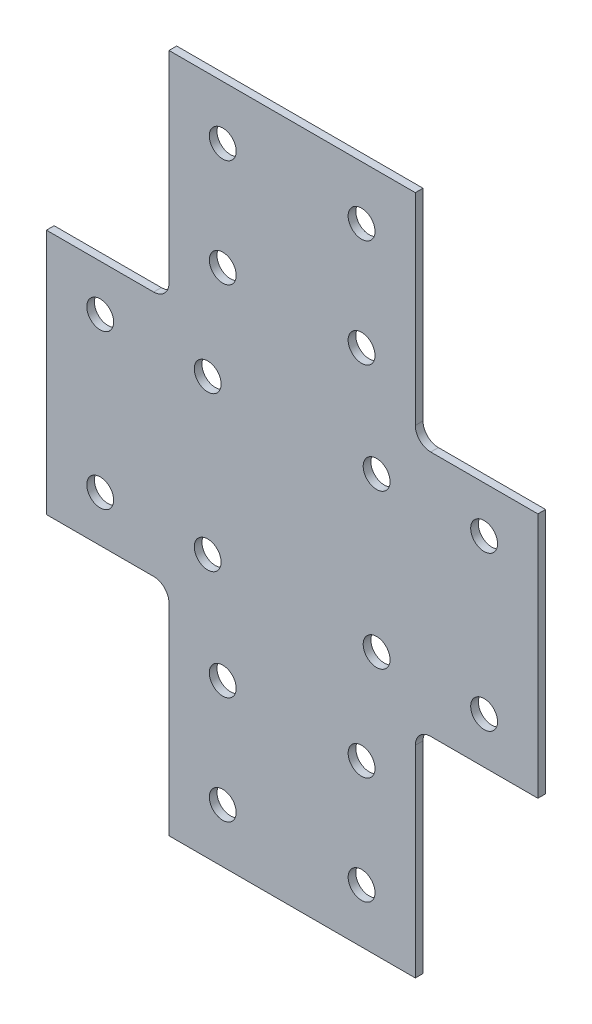
ISO-10303-21;
HEADER;
FILE_DESCRIPTION(('STEP AP214'),'2;1');
FILE_NAME('part.step','',(''),(''),'','','');
FILE_SCHEMA(('AUTOMOTIVE_DESIGN { 1 0 10303 214 1 1 1 1 }'));
ENDSEC;
DATA;
#1=APPLICATION_CONTEXT('core data for automotive mechanical design processes');
#2=APPLICATION_PROTOCOL_DEFINITION('international standard','automotive_design',2000,#1);
#3=PRODUCT_CONTEXT('',#1,'mechanical');
#4=PRODUCT('Part','Part','',(#3));
#5=PRODUCT_RELATED_PRODUCT_CATEGORY('part','',(#4));
#6=PRODUCT_DEFINITION_FORMATION('','',#4);
#7=PRODUCT_DEFINITION_CONTEXT('part definition',#1,'design');
#8=PRODUCT_DEFINITION('design','',#6,#7);
#9=PRODUCT_DEFINITION_SHAPE('','',#8);
#10=(LENGTH_UNIT() NAMED_UNIT(*) SI_UNIT(.MILLI.,.METRE.));
#11=(NAMED_UNIT(*) PLANE_ANGLE_UNIT() SI_UNIT($,.RADIAN.));
#12=(NAMED_UNIT(*) SI_UNIT($,.STERADIAN.) SOLID_ANGLE_UNIT());
#13=UNCERTAINTY_MEASURE_WITH_UNIT(LENGTH_MEASURE(1.E-05),#10,'distance_accuracy_value','');
#14=(GEOMETRIC_REPRESENTATION_CONTEXT(3) GLOBAL_UNCERTAINTY_ASSIGNED_CONTEXT((#13)) GLOBAL_UNIT_ASSIGNED_CONTEXT((#10,
#11,#12)) REPRESENTATION_CONTEXT('',''));
#15=CARTESIAN_POINT('',(0.,0.,0.));
#16=DIRECTION('',(0.,0.,1.));
#17=DIRECTION('',(1.,0.,0.));
#18=AXIS2_PLACEMENT_3D('',#15,#16,#17);
#19=CARTESIAN_POINT('',(20.2073636978671,1349.50975301925,6.35));
#20=DIRECTION('',(0.,0.,-1.));
#21=DIRECTION('',(-1.,0.,0.));
#22=AXIS2_PLACEMENT_3D('',#19,#20,#21);
#23=PLANE('',#22);
#24=CARTESIAN_POINT('',(77.103363697867,1566.99725301925,6.35));
#25=DIRECTION('',(0.,0.,1.));
#26=DIRECTION('',(1.,0.,0.));
#27=AXIS2_PLACEMENT_3D('',#24,#25,#26);
#28=CIRCLE('',#27,11.1125000000001);
#29=CARTESIAN_POINT('',(88.2158636978671,1566.99725301925,6.35));
#30=VERTEX_POINT('',#29);
#31=EDGE_CURVE('E644',#30,#30,#28,.T.);
#32=ORIENTED_EDGE('',*,*,#31,.F.);
#33=EDGE_LOOP('',(#32));
#34=FACE_BOUND('',#33,.T.);
#35=CARTESIAN_POINT('',(-24.2426363021329,1778.64275301925,6.35));
#36=DIRECTION('',(0.,0.,1.));
#37=DIRECTION('',(-1.,0.,0.));
#38=AXIS2_PLACEMENT_3D('',#35,#36,#37);
#39=CIRCLE('',#38,11.1125000000001);
#40=CARTESIAN_POINT('',(-35.3551363021329,1778.64275301925,6.35));
#41=VERTEX_POINT('',#40);
#42=EDGE_CURVE('E656',#41,#41,#39,.T.);
#43=ORIENTED_EDGE('',*,*,#42,.F.);
#44=EDGE_LOOP('',(#43));
#45=FACE_BOUND('',#44,.T.);
#46=CARTESIAN_POINT('',(-139.050636302133,1482.85975301925,6.35));
#47=DIRECTION('',(0.,0.,1.));
#48=DIRECTION('',(-1.,0.,0.));
#49=AXIS2_PLACEMENT_3D('',#46,#47,#48);
#50=CIRCLE('',#49,11.1125000000001);
#51=CARTESIAN_POINT('',(-150.163136302133,1482.85975301925,6.35));
#52=VERTEX_POINT('',#51);
#53=EDGE_CURVE('E668',#52,#52,#50,.T.);
#54=ORIENTED_EDGE('',*,*,#53,.F.);
#55=EDGE_LOOP('',(#54));
#56=FACE_BOUND('',#55,.T.);
#57=CARTESIAN_POINT('',(-139.050636302133,1778.64275301925,6.35));
#58=DIRECTION('',(0.,0.,1.));
#59=DIRECTION('',(1.,0.,0.));
#60=AXIS2_PLACEMENT_3D('',#57,#58,#59);
#61=CIRCLE('',#60,11.1125000000001);
#62=CARTESIAN_POINT('',(-127.938136302133,1778.64275301925,6.35));
#63=VERTEX_POINT('',#62);
#64=EDGE_CURVE('E680',#63,#63,#61,.T.);
#65=ORIENTED_EDGE('',*,*,#64,.F.);
#66=EDGE_LOOP('',(#65));
#67=FACE_BOUND('',#66,.T.);
#68=CARTESIAN_POINT('',(-151.496636302133,1566.99725301925,6.35));
#69=DIRECTION('',(0.,0.,1.));
#70=DIRECTION('',(-1.,0.,0.));
#71=AXIS2_PLACEMENT_3D('',#68,#69,#70);
#72=CIRCLE('',#71,11.1125000000001);
#73=CARTESIAN_POINT('',(-162.609136302133,1566.99725301925,6.35));
#74=VERTEX_POINT('',#73);
#75=EDGE_CURVE('E692',#74,#74,#72,.T.);
#76=ORIENTED_EDGE('',*,*,#75,.F.);
#77=EDGE_LOOP('',(#76));
#78=FACE_BOUND('',#77,.T.);
#79=CARTESIAN_POINT('',(-24.2426363021329,1393.95975301925,6.35));
#80=DIRECTION('',(0.,0.,1.));
#81=DIRECTION('',(1.,0.,0.));
#82=AXIS2_PLACEMENT_3D('',#79,#80,#81);
#83=CIRCLE('',#82,11.1125000000001);
#84=CARTESIAN_POINT('',(-13.1301363021328,1393.95975301925,6.35));
#85=VERTEX_POINT('',#84);
#86=EDGE_CURVE('E704',#85,#85,#83,.T.);
#87=ORIENTED_EDGE('',*,*,#86,.F.);
#88=EDGE_LOOP('',(#87));
#89=FACE_BOUND('',#88,.T.);
#90=CARTESIAN_POINT('',(-11.796636302133,1694.50525301925,6.35));
#91=DIRECTION('',(0.,0.,1.));
#92=DIRECTION('',(-1.,0.,0.));
#93=AXIS2_PLACEMENT_3D('',#90,#91,#92);
#94=CIRCLE('',#93,11.1125000000001);
#95=CARTESIAN_POINT('',(-22.9091363021332,1694.50525301925,6.35));
#96=VERTEX_POINT('',#95);
#97=EDGE_CURVE('E716',#96,#96,#94,.T.);
#98=ORIENTED_EDGE('',*,*,#97,.F.);
#99=EDGE_LOOP('',(#98));
#100=FACE_BOUND('',#99,.T.);
#101=CARTESIAN_POINT('',(-139.050636302133,1867.54275301925,6.35));
#102=DIRECTION('',(0.,0.,1.));
#103=DIRECTION('',(1.,0.,0.));
#104=AXIS2_PLACEMENT_3D('',#101,#102,#103);
#105=CIRCLE('',#104,11.1125000000001);
#106=CARTESIAN_POINT('',(-127.938136302133,1867.54275301925,6.35));
#107=VERTEX_POINT('',#106);
#108=EDGE_CURVE('E195',#107,#107,#105,.T.);
#109=ORIENTED_EDGE('',*,*,#108,.F.);
#110=EDGE_LOOP('',(#109));
#111=FACE_BOUND('',#110,.T.);
#112=DIRECTION('',(0.,1.,0.));
#113=VECTOR('',#112,1.);
#114=CARTESIAN_POINT('',(20.2073636978671,1528.89725301925,6.35));
#115=LINE('',#114,#113);
#116=CARTESIAN_POINT('',(20.2073636978671,1349.50975301925,6.35));
#117=VERTEX_POINT('',#116);
#118=CARTESIAN_POINT('',(20.2073636978671,1516.19725301925,6.35));
#119=VERTEX_POINT('',#118);
#120=EDGE_CURVE('E155',#117,#119,#115,.T.);
#121=ORIENTED_EDGE('',*,*,#120,.T.);
#122=CARTESIAN_POINT('',(32.9073636978671,1516.19725301925,6.35));
#123=DIRECTION('',(0.,0.,-1.));
#124=DIRECTION('',(-1.,0.,0.));
#125=AXIS2_PLACEMENT_3D('',#122,#123,#124);
#126=CIRCLE('',#125,12.7);
#127=CARTESIAN_POINT('',(32.9073636978671,1528.89725301925,6.35));
#128=VERTEX_POINT('',#127);
#129=EDGE_CURVE('E11',#119,#128,#126,.T.);
#130=ORIENTED_EDGE('',*,*,#129,.T.);
#131=DIRECTION('',(1.,0.,0.));
#132=VECTOR('',#131,1.);
#133=CARTESIAN_POINT('',(20.2073636978671,1528.89725301925,6.35));
#134=LINE('',#133,#132);
#135=CARTESIAN_POINT('',(121.553363697867,1528.89725301925,6.35));
#136=VERTEX_POINT('',#135);
#137=EDGE_CURVE('E144',#128,#136,#134,.T.);
#138=ORIENTED_EDGE('',*,*,#137,.T.);
#139=DIRECTION('',(0.,1.,0.));
#140=VECTOR('',#139,1.);
#141=CARTESIAN_POINT('',(121.553363697867,1528.89725301925,6.35));
#142=LINE('',#141,#140);
#143=CARTESIAN_POINT('',(121.553363697867,1732.60525301925,6.35));
#144=VERTEX_POINT('',#143);
#145=EDGE_CURVE('E149',#136,#144,#142,.T.);
#146=ORIENTED_EDGE('',*,*,#145,.T.);
#147=DIRECTION('',(-1.,0.,0.));
#148=VECTOR('',#147,1.);
#149=CARTESIAN_POINT('',(121.553363697867,1732.60525301925,6.35));
#150=LINE('',#149,#148);
#151=CARTESIAN_POINT('',(32.9073636978671,1732.60525301925,6.35));
#152=VERTEX_POINT('',#151);
#153=EDGE_CURVE('E169',#144,#152,#150,.T.);
#154=ORIENTED_EDGE('',*,*,#153,.T.);
#155=CARTESIAN_POINT('',(32.9073636978671,1745.30525301925,6.35));
#156=DIRECTION('',(0.,0.,-1.));
#157=DIRECTION('',(-1.,0.,0.));
#158=AXIS2_PLACEMENT_3D('',#155,#156,#157);
#159=CIRCLE('',#158,12.7);
#160=CARTESIAN_POINT('',(20.2073636978671,1745.30525301925,6.35));
#161=VERTEX_POINT('',#160);
#162=EDGE_CURVE('E265',#152,#161,#159,.T.);
#163=ORIENTED_EDGE('',*,*,#162,.T.);
#164=DIRECTION('',(0.,1.,0.));
#165=VECTOR('',#164,1.);
#166=CARTESIAN_POINT('',(20.207363697867,1732.60525301925,6.35));
#167=LINE('',#166,#165);
#168=CARTESIAN_POINT('',(20.2073636978671,1911.99275301925,6.35));
#169=VERTEX_POINT('',#168);
#170=EDGE_CURVE('E171',#161,#169,#167,.T.);
#171=ORIENTED_EDGE('',*,*,#170,.T.);
#172=DIRECTION('',(-1.,0.,0.));
#173=VECTOR('',#172,1.);
#174=CARTESIAN_POINT('',(20.2073636978671,1911.99275301925,6.35));
#175=LINE('',#174,#173);
#176=CARTESIAN_POINT('',(-183.500636302133,1911.99275301925,6.35));
#177=VERTEX_POINT('',#176);
#178=EDGE_CURVE('E176',#169,#177,#175,.T.);
#179=ORIENTED_EDGE('',*,*,#178,.T.);
#180=DIRECTION('',(0.,-1.,0.));
#181=VECTOR('',#180,1.);
#182=CARTESIAN_POINT('',(-183.500636302133,1732.60525301925,6.35));
#183=LINE('',#182,#181);
#184=CARTESIAN_POINT('',(-183.500636302133,1745.30525301925,6.35));
#185=VERTEX_POINT('',#184);
#186=EDGE_CURVE('E178',#177,#185,#183,.T.);
#187=ORIENTED_EDGE('',*,*,#186,.T.);
#188=CARTESIAN_POINT('',(-196.200636302133,1745.30525301925,6.35));
#189=DIRECTION('',(0.,0.,-1.));
#190=DIRECTION('',(-1.,0.,0.));
#191=AXIS2_PLACEMENT_3D('',#188,#189,#190);
#192=CIRCLE('',#191,12.7);
#193=CARTESIAN_POINT('',(-196.200636302133,1732.60525301925,6.35));
#194=VERTEX_POINT('',#193);
#195=EDGE_CURVE('E261',#185,#194,#192,.T.);
#196=ORIENTED_EDGE('',*,*,#195,.T.);
#197=DIRECTION('',(-1.,0.,0.));
#198=VECTOR('',#197,1.);
#199=CARTESIAN_POINT('',(-284.846636302133,1732.60525301925,6.35));
#200=LINE('',#199,#198);
#201=CARTESIAN_POINT('',(-284.846636302133,1732.60525301925,6.35));
#202=VERTEX_POINT('',#201);
#203=EDGE_CURVE('E181',#194,#202,#200,.T.);
#204=ORIENTED_EDGE('',*,*,#203,.T.);
#205=DIRECTION('',(0.,-1.,0.));
#206=VECTOR('',#205,1.);
#207=CARTESIAN_POINT('',(-284.846636302133,1528.89725301925,6.35));
#208=LINE('',#207,#206);
#209=CARTESIAN_POINT('',(-284.846636302133,1528.89725301925,6.35));
#210=VERTEX_POINT('',#209);
#211=EDGE_CURVE('E183',#202,#210,#208,.T.);
#212=ORIENTED_EDGE('',*,*,#211,.T.);
#213=DIRECTION('',(1.,0.,0.));
#214=VECTOR('',#213,1.);
#215=CARTESIAN_POINT('',(-183.500636302133,1528.89725301925,6.35));
#216=LINE('',#215,#214);
#217=CARTESIAN_POINT('',(-196.200636302133,1528.89725301925,6.35));
#218=VERTEX_POINT('',#217);
#219=EDGE_CURVE('E185',#210,#218,#216,.T.);
#220=ORIENTED_EDGE('',*,*,#219,.T.);
#221=CARTESIAN_POINT('',(-196.200636302133,1516.19725301925,6.35));
#222=DIRECTION('',(0.,0.,-1.));
#223=DIRECTION('',(-1.,0.,0.));
#224=AXIS2_PLACEMENT_3D('',#221,#222,#223);
#225=CIRCLE('',#224,12.7);
#226=CARTESIAN_POINT('',(-183.500636302133,1516.19725301925,6.35));
#227=VERTEX_POINT('',#226);
#228=EDGE_CURVE('E257',#218,#227,#225,.T.);
#229=ORIENTED_EDGE('',*,*,#228,.T.);
#230=DIRECTION('',(0.,-1.,0.));
#231=VECTOR('',#230,1.);
#232=CARTESIAN_POINT('',(-183.500636302133,1349.50975301925,6.35));
#233=LINE('',#232,#231);
#234=CARTESIAN_POINT('',(-183.500636302133,1349.50975301925,6.35));
#235=VERTEX_POINT('',#234);
#236=EDGE_CURVE('E188',#227,#235,#233,.T.);
#237=ORIENTED_EDGE('',*,*,#236,.T.);
#238=DIRECTION('',(1.,0.,0.));
#239=VECTOR('',#238,1.);
#240=CARTESIAN_POINT('',(20.2073636978671,1349.50975301925,6.35));
#241=LINE('',#240,#239);
#242=EDGE_CURVE('E190',#235,#117,#241,.T.);
#243=ORIENTED_EDGE('',*,*,#242,.T.);
#244=EDGE_LOOP('',(#121,#130,#138,#146,#154,#163,#171,#179,#187,#196,#204,#212,#220,#229,#237,#243));
#245=FACE_BOUND('',#244,.T.);
#246=CARTESIAN_POINT('',(-151.496636302133,1694.50525301925,6.35));
#247=DIRECTION('',(0.,0.,1.));
#248=DIRECTION('',(1.,0.,0.));
#249=AXIS2_PLACEMENT_3D('',#246,#247,#248);
#250=CIRCLE('',#249,11.1125000000001);
#251=CARTESIAN_POINT('',(-140.384136302133,1694.50525301925,6.35));
#252=VERTEX_POINT('',#251);
#253=EDGE_CURVE('E722',#252,#252,#250,.T.);
#254=ORIENTED_EDGE('',*,*,#253,.F.);
#255=EDGE_LOOP('',(#254));
#256=FACE_BOUND('',#255,.T.);
#257=CARTESIAN_POINT('',(-24.2426363021329,1867.54275301925,6.35));
#258=DIRECTION('',(0.,0.,1.));
#259=DIRECTION('',(-1.,0.,0.));
#260=AXIS2_PLACEMENT_3D('',#257,#258,#259);
#261=CIRCLE('',#260,11.1125000000001);
#262=CARTESIAN_POINT('',(-35.3551363021329,1867.54275301925,6.35));
#263=VERTEX_POINT('',#262);
#264=EDGE_CURVE('E710',#263,#263,#261,.T.);
#265=ORIENTED_EDGE('',*,*,#264,.F.);
#266=EDGE_LOOP('',(#265));
#267=FACE_BOUND('',#266,.T.);
#268=CARTESIAN_POINT('',(-139.050636302133,1393.95975301925,6.35));
#269=DIRECTION('',(0.,0.,1.));
#270=DIRECTION('',(-1.,0.,0.));
#271=AXIS2_PLACEMENT_3D('',#268,#269,#270);
#272=CIRCLE('',#271,11.1125000000001);
#273=CARTESIAN_POINT('',(-150.163136302133,1393.95975301925,6.35));
#274=VERTEX_POINT('',#273);
#275=EDGE_CURVE('E698',#274,#274,#272,.T.);
#276=ORIENTED_EDGE('',*,*,#275,.F.);
#277=EDGE_LOOP('',(#276));
#278=FACE_BOUND('',#277,.T.);
#279=CARTESIAN_POINT('',(-11.796636302133,1566.99725301925,6.35));
#280=DIRECTION('',(0.,0.,1.));
#281=DIRECTION('',(1.,0.,0.));
#282=AXIS2_PLACEMENT_3D('',#279,#280,#281);
#283=CIRCLE('',#282,11.1125000000001);
#284=CARTESIAN_POINT('',(-0.684136302132888,1566.99725301925,6.35));
#285=VERTEX_POINT('',#284);
#286=EDGE_CURVE('E686',#285,#285,#283,.T.);
#287=ORIENTED_EDGE('',*,*,#286,.F.);
#288=EDGE_LOOP('',(#287));
#289=FACE_BOUND('',#288,.T.);
#290=CARTESIAN_POINT('',(-240.396636302133,1694.50525301925,6.35));
#291=DIRECTION('',(0.,0.,1.));
#292=DIRECTION('',(1.,0.,0.));
#293=AXIS2_PLACEMENT_3D('',#290,#291,#292);
#294=CIRCLE('',#293,11.1125000000001);
#295=CARTESIAN_POINT('',(-229.284136302133,1694.50525301925,6.35));
#296=VERTEX_POINT('',#295);
#297=EDGE_CURVE('E674',#296,#296,#294,.T.);
#298=ORIENTED_EDGE('',*,*,#297,.F.);
#299=EDGE_LOOP('',(#298));
#300=FACE_BOUND('',#299,.T.);
#301=CARTESIAN_POINT('',(-240.396636302133,1566.99725301925,6.35));
#302=DIRECTION('',(0.,0.,1.));
#303=DIRECTION('',(-1.,0.,0.));
#304=AXIS2_PLACEMENT_3D('',#301,#302,#303);
#305=CIRCLE('',#304,11.1125000000001);
#306=CARTESIAN_POINT('',(-251.509136302133,1566.99725301925,6.35));
#307=VERTEX_POINT('',#306);
#308=EDGE_CURVE('E662',#307,#307,#305,.T.);
#309=ORIENTED_EDGE('',*,*,#308,.F.);
#310=EDGE_LOOP('',(#309));
#311=FACE_BOUND('',#310,.T.);
#312=CARTESIAN_POINT('',(77.103363697867,1694.50525301925,6.35));
#313=DIRECTION('',(0.,0.,1.));
#314=DIRECTION('',(-1.,0.,0.));
#315=AXIS2_PLACEMENT_3D('',#312,#313,#314);
#316=CIRCLE('',#315,11.1125000000001);
#317=CARTESIAN_POINT('',(65.9908636978669,1694.50525301925,6.35));
#318=VERTEX_POINT('',#317);
#319=EDGE_CURVE('E650',#318,#318,#316,.T.);
#320=ORIENTED_EDGE('',*,*,#319,.F.);
#321=EDGE_LOOP('',(#320));
#322=FACE_BOUND('',#321,.T.);
#323=CARTESIAN_POINT('',(-24.2426363021329,1482.85975301925,6.35));
#324=DIRECTION('',(0.,0.,1.));
#325=DIRECTION('',(1.,0.,0.));
#326=AXIS2_PLACEMENT_3D('',#323,#324,#325);
#327=CIRCLE('',#326,11.1125000000001);
#328=CARTESIAN_POINT('',(-13.1301363021328,1482.85975301925,6.35));
#329=VERTEX_POINT('',#328);
#330=EDGE_CURVE('E635',#329,#329,#327,.T.);
#331=ORIENTED_EDGE('',*,*,#330,.F.);
#332=EDGE_LOOP('',(#331));
#333=FACE_BOUND('',#332,.T.);
#334=ADVANCED_FACE('F32',(#34,#45,#56,#67,#78,#89,#100,#111,#245,#256,#267,#278,#289,#300,#311,
#322,#333),#23,.F.);
#335=CARTESIAN_POINT('',(20.2073636978671,1349.50975301925,0.));
#336=DIRECTION('',(0.,0.,-1.));
#337=DIRECTION('',(-1.,0.,0.));
#338=AXIS2_PLACEMENT_3D('',#335,#336,#337);
#339=PLANE('',#338);
#340=CARTESIAN_POINT('',(77.103363697867,1566.99725301925,0.));
#341=DIRECTION('',(0.,0.,1.));
#342=DIRECTION('',(1.,0.,0.));
#343=AXIS2_PLACEMENT_3D('',#340,#341,#342);
#344=CIRCLE('',#343,11.1125000000001);
#345=CARTESIAN_POINT('',(88.2158636978671,1566.99725301925,0.));
#346=VERTEX_POINT('',#345);
#347=EDGE_CURVE('E641',#346,#346,#344,.T.);
#348=ORIENTED_EDGE('',*,*,#347,.T.);
#349=EDGE_LOOP('',(#348));
#350=FACE_BOUND('',#349,.T.);
#351=CARTESIAN_POINT('',(-24.2426363021329,1778.64275301925,0.));
#352=DIRECTION('',(0.,0.,1.));
#353=DIRECTION('',(-1.,0.,0.));
#354=AXIS2_PLACEMENT_3D('',#351,#352,#353);
#355=CIRCLE('',#354,11.1125000000001);
#356=CARTESIAN_POINT('',(-35.3551363021329,1778.64275301925,0.));
#357=VERTEX_POINT('',#356);
#358=EDGE_CURVE('E653',#357,#357,#355,.T.);
#359=ORIENTED_EDGE('',*,*,#358,.T.);
#360=EDGE_LOOP('',(#359));
#361=FACE_BOUND('',#360,.T.);
#362=CARTESIAN_POINT('',(-139.050636302133,1482.85975301925,0.));
#363=DIRECTION('',(0.,0.,1.));
#364=DIRECTION('',(-1.,0.,0.));
#365=AXIS2_PLACEMENT_3D('',#362,#363,#364);
#366=CIRCLE('',#365,11.1125000000001);
#367=CARTESIAN_POINT('',(-150.163136302133,1482.85975301925,0.));
#368=VERTEX_POINT('',#367);
#369=EDGE_CURVE('E665',#368,#368,#366,.T.);
#370=ORIENTED_EDGE('',*,*,#369,.T.);
#371=EDGE_LOOP('',(#370));
#372=FACE_BOUND('',#371,.T.);
#373=CARTESIAN_POINT('',(-139.050636302133,1778.64275301925,0.));
#374=DIRECTION('',(0.,0.,1.));
#375=DIRECTION('',(1.,0.,0.));
#376=AXIS2_PLACEMENT_3D('',#373,#374,#375);
#377=CIRCLE('',#376,11.1125000000001);
#378=CARTESIAN_POINT('',(-127.938136302133,1778.64275301925,0.));
#379=VERTEX_POINT('',#378);
#380=EDGE_CURVE('E677',#379,#379,#377,.T.);
#381=ORIENTED_EDGE('',*,*,#380,.T.);
#382=EDGE_LOOP('',(#381));
#383=FACE_BOUND('',#382,.T.);
#384=CARTESIAN_POINT('',(-151.496636302133,1566.99725301925,0.));
#385=DIRECTION('',(0.,0.,1.));
#386=DIRECTION('',(-1.,0.,0.));
#387=AXIS2_PLACEMENT_3D('',#384,#385,#386);
#388=CIRCLE('',#387,11.1125000000001);
#389=CARTESIAN_POINT('',(-162.609136302133,1566.99725301925,0.));
#390=VERTEX_POINT('',#389);
#391=EDGE_CURVE('E689',#390,#390,#388,.T.);
#392=ORIENTED_EDGE('',*,*,#391,.T.);
#393=EDGE_LOOP('',(#392));
#394=FACE_BOUND('',#393,.T.);
#395=CARTESIAN_POINT('',(-24.2426363021329,1393.95975301925,0.));
#396=DIRECTION('',(0.,0.,1.));
#397=DIRECTION('',(1.,0.,0.));
#398=AXIS2_PLACEMENT_3D('',#395,#396,#397);
#399=CIRCLE('',#398,11.1125000000001);
#400=CARTESIAN_POINT('',(-13.1301363021328,1393.95975301925,0.));
#401=VERTEX_POINT('',#400);
#402=EDGE_CURVE('E701',#401,#401,#399,.T.);
#403=ORIENTED_EDGE('',*,*,#402,.T.);
#404=EDGE_LOOP('',(#403));
#405=FACE_BOUND('',#404,.T.);
#406=CARTESIAN_POINT('',(-11.796636302133,1694.50525301925,0.));
#407=DIRECTION('',(0.,0.,1.));
#408=DIRECTION('',(-1.,0.,0.));
#409=AXIS2_PLACEMENT_3D('',#406,#407,#408);
#410=CIRCLE('',#409,11.1125000000001);
#411=CARTESIAN_POINT('',(-22.9091363021332,1694.50525301925,0.));
#412=VERTEX_POINT('',#411);
#413=EDGE_CURVE('E713',#412,#412,#410,.T.);
#414=ORIENTED_EDGE('',*,*,#413,.T.);
#415=EDGE_LOOP('',(#414));
#416=FACE_BOUND('',#415,.T.);
#417=CARTESIAN_POINT('',(-139.050636302133,1867.54275301925,0.));
#418=DIRECTION('',(0.,0.,1.));
#419=DIRECTION('',(1.,0.,0.));
#420=AXIS2_PLACEMENT_3D('',#417,#418,#419);
#421=CIRCLE('',#420,11.1125000000001);
#422=CARTESIAN_POINT('',(-127.938136302133,1867.54275301925,0.));
#423=VERTEX_POINT('',#422);
#424=EDGE_CURVE('E725',#423,#423,#421,.T.);
#425=ORIENTED_EDGE('',*,*,#424,.T.);
#426=EDGE_LOOP('',(#425));
#427=FACE_BOUND('',#426,.T.);
#428=DIRECTION('',(0.,1.,0.));
#429=VECTOR('',#428,1.);
#430=CARTESIAN_POINT('',(20.2073636978671,1528.89725301925,0.));
#431=LINE('',#430,#429);
#432=CARTESIAN_POINT('',(20.2073636978671,1349.50975301925,0.));
#433=VERTEX_POINT('',#432);
#434=CARTESIAN_POINT('',(20.2073636978671,1516.19725301925,0.));
#435=VERTEX_POINT('',#434);
#436=EDGE_CURVE('E193',#433,#435,#431,.T.);
#437=ORIENTED_EDGE('',*,*,#436,.F.);
#438=DIRECTION('',(1.,0.,0.));
#439=VECTOR('',#438,1.);
#440=CARTESIAN_POINT('',(20.2073636978671,1349.50975301925,0.));
#441=LINE('',#440,#439);
#442=CARTESIAN_POINT('',(-183.500636302133,1349.50975301925,0.));
#443=VERTEX_POINT('',#442);
#444=EDGE_CURVE('E218',#443,#433,#441,.T.);
#445=ORIENTED_EDGE('',*,*,#444,.F.);
#446=DIRECTION('',(0.,-1.,0.));
#447=VECTOR('',#446,1.);
#448=CARTESIAN_POINT('',(-183.500636302133,1349.50975301925,0.));
#449=LINE('',#448,#447);
#450=CARTESIAN_POINT('',(-183.500636302133,1516.19725301925,0.));
#451=VERTEX_POINT('',#450);
#452=EDGE_CURVE('E216',#451,#443,#449,.T.);
#453=ORIENTED_EDGE('',*,*,#452,.F.);
#454=CARTESIAN_POINT('',(-196.200636302133,1516.19725301925,0.));
#455=DIRECTION('',(0.,0.,-1.));
#456=DIRECTION('',(-1.,0.,0.));
#457=AXIS2_PLACEMENT_3D('',#454,#455,#456);
#458=CIRCLE('',#457,12.7);
#459=CARTESIAN_POINT('',(-196.200636302133,1528.89725301925,0.));
#460=VERTEX_POINT('',#459);
#461=EDGE_CURVE('E255',#451,#460,#458,.F.);
#462=ORIENTED_EDGE('',*,*,#461,.T.);
#463=DIRECTION('',(1.,0.,0.));
#464=VECTOR('',#463,1.);
#465=CARTESIAN_POINT('',(-183.500636302133,1528.89725301925,0.));
#466=LINE('',#465,#464);
#467=CARTESIAN_POINT('',(-284.846636302133,1528.89725301925,0.));
#468=VERTEX_POINT('',#467);
#469=EDGE_CURVE('E213',#468,#460,#466,.T.);
#470=ORIENTED_EDGE('',*,*,#469,.F.);
#471=DIRECTION('',(0.,-1.,0.));
#472=VECTOR('',#471,1.);
#473=CARTESIAN_POINT('',(-284.846636302133,1528.89725301925,0.));
#474=LINE('',#473,#472);
#475=CARTESIAN_POINT('',(-284.846636302133,1732.60525301925,0.));
#476=VERTEX_POINT('',#475);
#477=EDGE_CURVE('E211',#476,#468,#474,.T.);
#478=ORIENTED_EDGE('',*,*,#477,.F.);
#479=DIRECTION('',(-1.,0.,0.));
#480=VECTOR('',#479,1.);
#481=CARTESIAN_POINT('',(-284.846636302133,1732.60525301925,0.));
#482=LINE('',#481,#480);
#483=CARTESIAN_POINT('',(-196.200636302133,1732.60525301925,0.));
#484=VERTEX_POINT('',#483);
#485=EDGE_CURVE('E209',#484,#476,#482,.T.);
#486=ORIENTED_EDGE('',*,*,#485,.F.);
#487=CARTESIAN_POINT('',(-196.200636302133,1745.30525301925,0.));
#488=DIRECTION('',(0.,0.,-1.));
#489=DIRECTION('',(-1.,0.,0.));
#490=AXIS2_PLACEMENT_3D('',#487,#488,#489);
#491=CIRCLE('',#490,12.7);
#492=CARTESIAN_POINT('',(-183.500636302133,1745.30525301925,0.));
#493=VERTEX_POINT('',#492);
#494=EDGE_CURVE('E259',#484,#493,#491,.F.);
#495=ORIENTED_EDGE('',*,*,#494,.T.);
#496=DIRECTION('',(0.,-1.,0.));
#497=VECTOR('',#496,1.);
#498=CARTESIAN_POINT('',(-183.500636302133,1732.60525301925,0.));
#499=LINE('',#498,#497);
#500=CARTESIAN_POINT('',(-183.500636302133,1911.99275301925,0.));
#501=VERTEX_POINT('',#500);
#502=EDGE_CURVE('E206',#501,#493,#499,.T.);
#503=ORIENTED_EDGE('',*,*,#502,.F.);
#504=DIRECTION('',(-1.,0.,0.));
#505=VECTOR('',#504,1.);
#506=CARTESIAN_POINT('',(20.2073636978671,1911.99275301925,0.));
#507=LINE('',#506,#505);
#508=CARTESIAN_POINT('',(20.2073636978671,1911.99275301925,0.));
#509=VERTEX_POINT('',#508);
#510=EDGE_CURVE('E204',#509,#501,#507,.T.);
#511=ORIENTED_EDGE('',*,*,#510,.F.);
#512=DIRECTION('',(0.,1.,0.));
#513=VECTOR('',#512,1.);
#514=CARTESIAN_POINT('',(20.207363697867,1732.60525301925,0.));
#515=LINE('',#514,#513);
#516=CARTESIAN_POINT('',(20.2073636978671,1745.30525301925,0.));
#517=VERTEX_POINT('',#516);
#518=EDGE_CURVE('E202',#517,#509,#515,.T.);
#519=ORIENTED_EDGE('',*,*,#518,.F.);
#520=CARTESIAN_POINT('',(32.9073636978671,1745.30525301925,0.));
#521=DIRECTION('',(0.,0.,-1.));
#522=DIRECTION('',(-1.,0.,0.));
#523=AXIS2_PLACEMENT_3D('',#520,#521,#522);
#524=CIRCLE('',#523,12.7);
#525=CARTESIAN_POINT('',(32.9073636978671,1732.60525301925,0.));
#526=VERTEX_POINT('',#525);
#527=EDGE_CURVE('E263',#517,#526,#524,.F.);
#528=ORIENTED_EDGE('',*,*,#527,.T.);
#529=DIRECTION('',(-1.,0.,0.));
#530=VECTOR('',#529,1.);
#531=CARTESIAN_POINT('',(121.553363697867,1732.60525301925,0.));
#532=LINE('',#531,#530);
#533=CARTESIAN_POINT('',(121.553363697867,1732.60525301925,0.));
#534=VERTEX_POINT('',#533);
#535=EDGE_CURVE('E199',#534,#526,#532,.T.);
#536=ORIENTED_EDGE('',*,*,#535,.F.);
#537=DIRECTION('',(0.,1.,0.));
#538=VECTOR('',#537,1.);
#539=CARTESIAN_POINT('',(121.553363697867,1528.89725301925,0.));
#540=LINE('',#539,#538);
#541=CARTESIAN_POINT('',(121.553363697867,1528.89725301925,0.));
#542=VERTEX_POINT('',#541);
#543=EDGE_CURVE('E197',#542,#534,#540,.T.);
#544=ORIENTED_EDGE('',*,*,#543,.F.);
#545=DIRECTION('',(1.,0.,0.));
#546=VECTOR('',#545,1.);
#547=CARTESIAN_POINT('',(20.2073636978671,1528.89725301925,0.));
#548=LINE('',#547,#546);
#549=CARTESIAN_POINT('',(32.9073636978671,1528.89725301925,0.));
#550=VERTEX_POINT('',#549);
#551=EDGE_CURVE('E160',#550,#542,#548,.T.);
#552=ORIENTED_EDGE('',*,*,#551,.F.);
#553=CARTESIAN_POINT('',(32.9073636978671,1516.19725301925,0.));
#554=DIRECTION('',(0.,0.,-1.));
#555=DIRECTION('',(-1.,0.,0.));
#556=AXIS2_PLACEMENT_3D('',#553,#554,#555);
#557=CIRCLE('',#556,12.7);
#558=EDGE_CURVE('E40',#550,#435,#557,.F.);
#559=ORIENTED_EDGE('',*,*,#558,.T.);
#560=EDGE_LOOP('',(#437,#445,#453,#462,#470,#478,#486,#495,#503,#511,#519,#528,#536,#544,#552,#559));
#561=FACE_BOUND('',#560,.T.);
#562=CARTESIAN_POINT('',(-151.496636302133,1694.50525301925,0.));
#563=DIRECTION('',(0.,0.,1.));
#564=DIRECTION('',(1.,0.,0.));
#565=AXIS2_PLACEMENT_3D('',#562,#563,#564);
#566=CIRCLE('',#565,11.1125000000001);
#567=CARTESIAN_POINT('',(-140.384136302133,1694.50525301925,0.));
#568=VERTEX_POINT('',#567);
#569=EDGE_CURVE('E719',#568,#568,#566,.T.);
#570=ORIENTED_EDGE('',*,*,#569,.T.);
#571=EDGE_LOOP('',(#570));
#572=FACE_BOUND('',#571,.T.);
#573=CARTESIAN_POINT('',(-24.2426363021329,1867.54275301925,0.));
#574=DIRECTION('',(0.,0.,1.));
#575=DIRECTION('',(-1.,0.,0.));
#576=AXIS2_PLACEMENT_3D('',#573,#574,#575);
#577=CIRCLE('',#576,11.1125000000001);
#578=CARTESIAN_POINT('',(-35.3551363021329,1867.54275301925,0.));
#579=VERTEX_POINT('',#578);
#580=EDGE_CURVE('E707',#579,#579,#577,.T.);
#581=ORIENTED_EDGE('',*,*,#580,.T.);
#582=EDGE_LOOP('',(#581));
#583=FACE_BOUND('',#582,.T.);
#584=CARTESIAN_POINT('',(-139.050636302133,1393.95975301925,0.));
#585=DIRECTION('',(0.,0.,1.));
#586=DIRECTION('',(-1.,0.,0.));
#587=AXIS2_PLACEMENT_3D('',#584,#585,#586);
#588=CIRCLE('',#587,11.1125000000001);
#589=CARTESIAN_POINT('',(-150.163136302133,1393.95975301925,0.));
#590=VERTEX_POINT('',#589);
#591=EDGE_CURVE('E695',#590,#590,#588,.T.);
#592=ORIENTED_EDGE('',*,*,#591,.T.);
#593=EDGE_LOOP('',(#592));
#594=FACE_BOUND('',#593,.T.);
#595=CARTESIAN_POINT('',(-11.796636302133,1566.99725301925,0.));
#596=DIRECTION('',(0.,0.,1.));
#597=DIRECTION('',(1.,0.,0.));
#598=AXIS2_PLACEMENT_3D('',#595,#596,#597);
#599=CIRCLE('',#598,11.1125000000001);
#600=CARTESIAN_POINT('',(-0.684136302132888,1566.99725301925,0.));
#601=VERTEX_POINT('',#600);
#602=EDGE_CURVE('E683',#601,#601,#599,.T.);
#603=ORIENTED_EDGE('',*,*,#602,.T.);
#604=EDGE_LOOP('',(#603));
#605=FACE_BOUND('',#604,.T.);
#606=CARTESIAN_POINT('',(-240.396636302133,1694.50525301925,0.));
#607=DIRECTION('',(0.,0.,1.));
#608=DIRECTION('',(1.,0.,0.));
#609=AXIS2_PLACEMENT_3D('',#606,#607,#608);
#610=CIRCLE('',#609,11.1125000000001);
#611=CARTESIAN_POINT('',(-229.284136302133,1694.50525301925,0.));
#612=VERTEX_POINT('',#611);
#613=EDGE_CURVE('E671',#612,#612,#610,.T.);
#614=ORIENTED_EDGE('',*,*,#613,.T.);
#615=EDGE_LOOP('',(#614));
#616=FACE_BOUND('',#615,.T.);
#617=CARTESIAN_POINT('',(-240.396636302133,1566.99725301925,0.));
#618=DIRECTION('',(0.,0.,1.));
#619=DIRECTION('',(-1.,0.,0.));
#620=AXIS2_PLACEMENT_3D('',#617,#618,#619);
#621=CIRCLE('',#620,11.1125000000001);
#622=CARTESIAN_POINT('',(-251.509136302133,1566.99725301925,0.));
#623=VERTEX_POINT('',#622);
#624=EDGE_CURVE('E659',#623,#623,#621,.T.);
#625=ORIENTED_EDGE('',*,*,#624,.T.);
#626=EDGE_LOOP('',(#625));
#627=FACE_BOUND('',#626,.T.);
#628=CARTESIAN_POINT('',(77.103363697867,1694.50525301925,0.));
#629=DIRECTION('',(0.,0.,1.));
#630=DIRECTION('',(-1.,0.,0.));
#631=AXIS2_PLACEMENT_3D('',#628,#629,#630);
#632=CIRCLE('',#631,11.1125000000001);
#633=CARTESIAN_POINT('',(65.9908636978669,1694.50525301925,0.));
#634=VERTEX_POINT('',#633);
#635=EDGE_CURVE('E647',#634,#634,#632,.T.);
#636=ORIENTED_EDGE('',*,*,#635,.T.);
#637=EDGE_LOOP('',(#636));
#638=FACE_BOUND('',#637,.T.);
#639=CARTESIAN_POINT('',(-24.2426363021329,1482.85975301925,0.));
#640=DIRECTION('',(0.,0.,1.));
#641=DIRECTION('',(1.,0.,0.));
#642=AXIS2_PLACEMENT_3D('',#639,#640,#641);
#643=CIRCLE('',#642,11.1125000000001);
#644=CARTESIAN_POINT('',(-13.1301363021328,1482.85975301925,0.));
#645=VERTEX_POINT('',#644);
#646=EDGE_CURVE('E638',#645,#645,#643,.T.);
#647=ORIENTED_EDGE('',*,*,#646,.T.);
#648=EDGE_LOOP('',(#647));
#649=FACE_BOUND('',#648,.T.);
#650=ADVANCED_FACE('F278',(#350,#361,#372,#383,#394,#405,#416,#427,#561,#572,#583,#594,#605,
#616,#627,#638,#649),#339,.T.);
#651=CARTESIAN_POINT('',(20.2073636978671,1528.89725301925,6.35));
#652=DIRECTION('',(-1.,0.,0.));
#653=DIRECTION('',(0.,0.,1.));
#654=AXIS2_PLACEMENT_3D('',#651,#652,#653);
#655=PLANE('',#654);
#656=ORIENTED_EDGE('',*,*,#436,.T.);
#657=DIRECTION('',(0.,0.,-1.));
#658=VECTOR('',#657,1.);
#659=CARTESIAN_POINT('',(20.2073636978671,1516.19725301925,6.35));
#660=LINE('',#659,#658);
#661=EDGE_CURVE('E47',#435,#119,#660,.F.);
#662=ORIENTED_EDGE('',*,*,#661,.T.);
#663=ORIENTED_EDGE('',*,*,#120,.F.);
#664=DIRECTION('',(0.,0.,-1.));
#665=VECTOR('',#664,1.);
#666=CARTESIAN_POINT('',(20.2073636978671,1349.50975301925,6.35));
#667=LINE('',#666,#665);
#668=EDGE_CURVE('E192',#117,#433,#667,.T.);
#669=ORIENTED_EDGE('',*,*,#668,.T.);
#670=EDGE_LOOP('',(#656,#662,#663,#669));
#671=FACE_BOUND('',#670,.T.);
#672=ADVANCED_FACE('F298',(#671),#655,.F.);
#673=CARTESIAN_POINT('',(20.2073636978671,1528.89725301925,6.35));
#674=DIRECTION('',(0.,1.,0.));
#675=DIRECTION('',(0.,0.,1.));
#676=AXIS2_PLACEMENT_3D('',#673,#674,#675);
#677=PLANE('',#676);
#678=ORIENTED_EDGE('',*,*,#137,.F.);
#679=DIRECTION('',(0.,0.,-1.));
#680=VECTOR('',#679,1.);
#681=CARTESIAN_POINT('',(32.9073636978671,1528.89725301925,0.));
#682=LINE('',#681,#680);
#683=EDGE_CURVE('E252',#128,#550,#682,.T.);
#684=ORIENTED_EDGE('',*,*,#683,.T.);
#685=ORIENTED_EDGE('',*,*,#551,.T.);
#686=DIRECTION('',(0.,0.,-1.));
#687=VECTOR('',#686,1.);
#688=CARTESIAN_POINT('',(121.553363697867,1528.89725301925,6.35));
#689=LINE('',#688,#687);
#690=EDGE_CURVE('E158',#136,#542,#689,.T.);
#691=ORIENTED_EDGE('',*,*,#690,.F.);
#692=EDGE_LOOP('',(#678,#684,#685,#691));
#693=FACE_BOUND('',#692,.T.);
#694=ADVANCED_FACE('F159',(#693),#677,.F.);
#695=CARTESIAN_POINT('',(121.553363697867,1528.89725301925,6.35));
#696=DIRECTION('',(-1.,0.,0.));
#697=DIRECTION('',(0.,0.,1.));
#698=AXIS2_PLACEMENT_3D('',#695,#696,#697);
#699=PLANE('',#698);
#700=ORIENTED_EDGE('',*,*,#543,.T.);
#701=DIRECTION('',(0.,0.,-1.));
#702=VECTOR('',#701,1.);
#703=CARTESIAN_POINT('',(121.553363697867,1732.60525301925,6.35));
#704=LINE('',#703,#702);
#705=EDGE_CURVE('E164',#144,#534,#704,.T.);
#706=ORIENTED_EDGE('',*,*,#705,.F.);
#707=ORIENTED_EDGE('',*,*,#145,.F.);
#708=ORIENTED_EDGE('',*,*,#690,.T.);
#709=EDGE_LOOP('',(#700,#706,#707,#708));
#710=FACE_BOUND('',#709,.T.);
#711=ADVANCED_FACE('F166',(#710),#699,.F.);
#712=CARTESIAN_POINT('',(121.553363697867,1732.60525301925,6.35));
#713=DIRECTION('',(0.,-1.,0.));
#714=DIRECTION('',(1.,0.,0.));
#715=AXIS2_PLACEMENT_3D('',#712,#713,#714);
#716=PLANE('',#715);
#717=ORIENTED_EDGE('',*,*,#535,.T.);
#718=DIRECTION('',(0.,0.,-1.));
#719=VECTOR('',#718,1.);
#720=CARTESIAN_POINT('',(32.9073636978671,1732.60525301925,6.35));
#721=LINE('',#720,#719);
#722=EDGE_CURVE('E250',#526,#152,#721,.F.);
#723=ORIENTED_EDGE('',*,*,#722,.T.);
#724=ORIENTED_EDGE('',*,*,#153,.F.);
#725=ORIENTED_EDGE('',*,*,#705,.T.);
#726=EDGE_LOOP('',(#717,#723,#724,#725));
#727=FACE_BOUND('',#726,.T.);
#728=ADVANCED_FACE('F282',(#727),#716,.F.);
#729=CARTESIAN_POINT('',(20.207363697867,1732.60525301925,6.35));
#730=DIRECTION('',(-1.,0.,0.));
#731=DIRECTION('',(0.,-1.,0.));
#732=AXIS2_PLACEMENT_3D('',#729,#730,#731);
#733=PLANE('',#732);
#734=ORIENTED_EDGE('',*,*,#170,.F.);
#735=DIRECTION('',(0.,0.,-1.));
#736=VECTOR('',#735,1.);
#737=CARTESIAN_POINT('',(20.2073636978671,1745.30525301925,0.));
#738=LINE('',#737,#736);
#739=EDGE_CURVE('E247',#161,#517,#738,.T.);
#740=ORIENTED_EDGE('',*,*,#739,.T.);
#741=ORIENTED_EDGE('',*,*,#518,.T.);
#742=DIRECTION('',(0.,0.,-1.));
#743=VECTOR('',#742,1.);
#744=CARTESIAN_POINT('',(20.2073636978671,1911.99275301925,6.35));
#745=LINE('',#744,#743);
#746=EDGE_CURVE('E234',#169,#509,#745,.T.);
#747=ORIENTED_EDGE('',*,*,#746,.F.);
#748=EDGE_LOOP('',(#734,#740,#741,#747));
#749=FACE_BOUND('',#748,.T.);
#750=ADVANCED_FACE('F273',(#749),#733,.F.);
#751=CARTESIAN_POINT('',(20.2073636978671,1911.99275301925,6.35));
#752=DIRECTION('',(0.,-1.,0.));
#753=DIRECTION('',(0.,0.,-1.));
#754=AXIS2_PLACEMENT_3D('',#751,#752,#753);
#755=PLANE('',#754);
#756=ORIENTED_EDGE('',*,*,#510,.T.);
#757=DIRECTION('',(0.,0.,-1.));
#758=VECTOR('',#757,1.);
#759=CARTESIAN_POINT('',(-183.500636302133,1911.99275301925,6.35));
#760=LINE('',#759,#758);
#761=EDGE_CURVE('E231',#177,#501,#760,.T.);
#762=ORIENTED_EDGE('',*,*,#761,.F.);
#763=ORIENTED_EDGE('',*,*,#178,.F.);
#764=ORIENTED_EDGE('',*,*,#746,.T.);
#765=EDGE_LOOP('',(#756,#762,#763,#764));
#766=FACE_BOUND('',#765,.T.);
#767=ADVANCED_FACE('F289',(#766),#755,.F.);
#768=CARTESIAN_POINT('',(-183.500636302133,1732.60525301925,6.35));
#769=DIRECTION('',(1.,0.,0.));
#770=DIRECTION('',(0.,0.,-1.));
#771=AXIS2_PLACEMENT_3D('',#768,#769,#770);
#772=PLANE('',#771);
#773=ORIENTED_EDGE('',*,*,#502,.T.);
#774=DIRECTION('',(0.,0.,-1.));
#775=VECTOR('',#774,1.);
#776=CARTESIAN_POINT('',(-183.500636302133,1745.30525301925,6.35));
#777=LINE('',#776,#775);
#778=EDGE_CURVE('E245',#493,#185,#777,.F.);
#779=ORIENTED_EDGE('',*,*,#778,.T.);
#780=ORIENTED_EDGE('',*,*,#186,.F.);
#781=ORIENTED_EDGE('',*,*,#761,.T.);
#782=EDGE_LOOP('',(#773,#779,#780,#781));
#783=FACE_BOUND('',#782,.T.);
#784=ADVANCED_FACE('F326',(#783),#772,.F.);
#785=CARTESIAN_POINT('',(-284.846636302133,1732.60525301925,6.35));
#786=DIRECTION('',(0.,-1.,0.));
#787=DIRECTION('',(0.,0.,-1.));
#788=AXIS2_PLACEMENT_3D('',#785,#786,#787);
#789=PLANE('',#788);
#790=ORIENTED_EDGE('',*,*,#203,.F.);
#791=DIRECTION('',(0.,0.,-1.));
#792=VECTOR('',#791,1.);
#793=CARTESIAN_POINT('',(-196.200636302133,1732.60525301925,0.));
#794=LINE('',#793,#792);
#795=EDGE_CURVE('E242',#194,#484,#794,.T.);
#796=ORIENTED_EDGE('',*,*,#795,.T.);
#797=ORIENTED_EDGE('',*,*,#485,.T.);
#798=DIRECTION('',(0.,0.,-1.));
#799=VECTOR('',#798,1.);
#800=CARTESIAN_POINT('',(-284.846636302133,1732.60525301925,6.35));
#801=LINE('',#800,#799);
#802=EDGE_CURVE('E228',#202,#476,#801,.T.);
#803=ORIENTED_EDGE('',*,*,#802,.F.);
#804=EDGE_LOOP('',(#790,#796,#797,#803));
#805=FACE_BOUND('',#804,.T.);
#806=ADVANCED_FACE('F322',(#805),#789,.F.);
#807=CARTESIAN_POINT('',(-284.846636302133,1528.89725301925,6.35));
#808=DIRECTION('',(1.,0.,0.));
#809=DIRECTION('',(0.,0.,-1.));
#810=AXIS2_PLACEMENT_3D('',#807,#808,#809);
#811=PLANE('',#810);
#812=ORIENTED_EDGE('',*,*,#477,.T.);
#813=DIRECTION('',(0.,0.,-1.));
#814=VECTOR('',#813,1.);
#815=CARTESIAN_POINT('',(-284.846636302133,1528.89725301925,6.35));
#816=LINE('',#815,#814);
#817=EDGE_CURVE('E225',#210,#468,#816,.T.);
#818=ORIENTED_EDGE('',*,*,#817,.F.);
#819=ORIENTED_EDGE('',*,*,#211,.F.);
#820=ORIENTED_EDGE('',*,*,#802,.T.);
#821=EDGE_LOOP('',(#812,#818,#819,#820));
#822=FACE_BOUND('',#821,.T.);
#823=ADVANCED_FACE('F318',(#822),#811,.F.);
#824=CARTESIAN_POINT('',(-183.500636302133,1528.89725301925,6.35));
#825=DIRECTION('',(0.,1.,0.));
#826=DIRECTION('',(-1.,0.,0.));
#827=AXIS2_PLACEMENT_3D('',#824,#825,#826);
#828=PLANE('',#827);
#829=ORIENTED_EDGE('',*,*,#469,.T.);
#830=DIRECTION('',(0.,0.,-1.));
#831=VECTOR('',#830,1.);
#832=CARTESIAN_POINT('',(-196.200636302133,1528.89725301925,6.35));
#833=LINE('',#832,#831);
#834=EDGE_CURVE('E240',#460,#218,#833,.F.);
#835=ORIENTED_EDGE('',*,*,#834,.T.);
#836=ORIENTED_EDGE('',*,*,#219,.F.);
#837=ORIENTED_EDGE('',*,*,#817,.T.);
#838=EDGE_LOOP('',(#829,#835,#836,#837));
#839=FACE_BOUND('',#838,.T.);
#840=ADVANCED_FACE('F314',(#839),#828,.F.);
#841=CARTESIAN_POINT('',(-183.500636302133,1349.50975301925,6.35));
#842=DIRECTION('',(1.,0.,0.));
#843=DIRECTION('',(0.,0.,-1.));
#844=AXIS2_PLACEMENT_3D('',#841,#842,#843);
#845=PLANE('',#844);
#846=ORIENTED_EDGE('',*,*,#236,.F.);
#847=DIRECTION('',(0.,0.,-1.));
#848=VECTOR('',#847,1.);
#849=CARTESIAN_POINT('',(-183.500636302133,1516.19725301925,0.));
#850=LINE('',#849,#848);
#851=EDGE_CURVE('E163',#227,#451,#850,.T.);
#852=ORIENTED_EDGE('',*,*,#851,.T.);
#853=ORIENTED_EDGE('',*,*,#452,.T.);
#854=DIRECTION('',(0.,0.,-1.));
#855=VECTOR('',#854,1.);
#856=CARTESIAN_POINT('',(-183.500636302133,1349.50975301925,6.35));
#857=LINE('',#856,#855);
#858=EDGE_CURVE('E222',#235,#443,#857,.T.);
#859=ORIENTED_EDGE('',*,*,#858,.F.);
#860=EDGE_LOOP('',(#846,#852,#853,#859));
#861=FACE_BOUND('',#860,.T.);
#862=ADVANCED_FACE('F310',(#861),#845,.F.);
#863=CARTESIAN_POINT('',(20.2073636978671,1349.50975301925,6.35));
#864=DIRECTION('',(0.,1.,0.));
#865=DIRECTION('',(0.,0.,1.));
#866=AXIS2_PLACEMENT_3D('',#863,#864,#865);
#867=PLANE('',#866);
#868=ORIENTED_EDGE('',*,*,#444,.T.);
#869=ORIENTED_EDGE('',*,*,#668,.F.);
#870=ORIENTED_EDGE('',*,*,#242,.F.);
#871=ORIENTED_EDGE('',*,*,#858,.T.);
#872=EDGE_LOOP('',(#868,#869,#870,#871));
#873=FACE_BOUND('',#872,.T.);
#874=ADVANCED_FACE('F307',(#873),#867,.F.);
#875=CARTESIAN_POINT('',(-139.050636302133,1867.54275301925,6.35));
#876=DIRECTION('',(0.,0.,-1.));
#877=DIRECTION('',(-1.,0.,0.));
#878=AXIS2_PLACEMENT_3D('',#875,#876,#877);
#879=CYLINDRICAL_SURFACE('',#878,11.1125000000001);
#880=ORIENTED_EDGE('',*,*,#108,.T.);
#881=EDGE_LOOP('',(#880));
#882=FACE_BOUND('',#881,.T.);
#883=ORIENTED_EDGE('',*,*,#424,.F.);
#884=EDGE_LOOP('',(#883));
#885=FACE_BOUND('',#884,.T.);
#886=ADVANCED_FACE('F304',(#882,#885),#879,.F.);
#887=CARTESIAN_POINT('',(-151.496636302133,1694.50525301925,6.35));
#888=DIRECTION('',(0.,0.,-1.));
#889=DIRECTION('',(-1.,0.,0.));
#890=AXIS2_PLACEMENT_3D('',#887,#888,#889);
#891=CYLINDRICAL_SURFACE('',#890,11.1125000000001);
#892=ORIENTED_EDGE('',*,*,#253,.T.);
#893=EDGE_LOOP('',(#892));
#894=FACE_BOUND('',#893,.T.);
#895=ORIENTED_EDGE('',*,*,#569,.F.);
#896=EDGE_LOOP('',(#895));
#897=FACE_BOUND('',#896,.T.);
#898=ADVANCED_FACE('F417',(#894,#897),#891,.F.);
#899=CARTESIAN_POINT('',(-11.796636302133,1694.50525301925,6.35));
#900=DIRECTION('',(0.,0.,-1.));
#901=DIRECTION('',(-1.,0.,0.));
#902=AXIS2_PLACEMENT_3D('',#899,#900,#901);
#903=CYLINDRICAL_SURFACE('',#902,11.1125000000001);
#904=ORIENTED_EDGE('',*,*,#97,.T.);
#905=EDGE_LOOP('',(#904));
#906=FACE_BOUND('',#905,.T.);
#907=ORIENTED_EDGE('',*,*,#413,.F.);
#908=EDGE_LOOP('',(#907));
#909=FACE_BOUND('',#908,.T.);
#910=ADVANCED_FACE('F426',(#906,#909),#903,.F.);
#911=CARTESIAN_POINT('',(-24.2426363021329,1867.54275301925,6.35));
#912=DIRECTION('',(0.,0.,-1.));
#913=DIRECTION('',(-1.,0.,0.));
#914=AXIS2_PLACEMENT_3D('',#911,#912,#913);
#915=CYLINDRICAL_SURFACE('',#914,11.1125000000001);
#916=ORIENTED_EDGE('',*,*,#264,.T.);
#917=EDGE_LOOP('',(#916));
#918=FACE_BOUND('',#917,.T.);
#919=ORIENTED_EDGE('',*,*,#580,.F.);
#920=EDGE_LOOP('',(#919));
#921=FACE_BOUND('',#920,.T.);
#922=ADVANCED_FACE('F435',(#918,#921),#915,.F.);
#923=CARTESIAN_POINT('',(-24.2426363021329,1393.95975301925,6.35));
#924=DIRECTION('',(0.,0.,-1.));
#925=DIRECTION('',(-1.,0.,0.));
#926=AXIS2_PLACEMENT_3D('',#923,#924,#925);
#927=CYLINDRICAL_SURFACE('',#926,11.1125000000001);
#928=ORIENTED_EDGE('',*,*,#86,.T.);
#929=EDGE_LOOP('',(#928));
#930=FACE_BOUND('',#929,.T.);
#931=ORIENTED_EDGE('',*,*,#402,.F.);
#932=EDGE_LOOP('',(#931));
#933=FACE_BOUND('',#932,.T.);
#934=ADVANCED_FACE('F445',(#930,#933),#927,.F.);
#935=CARTESIAN_POINT('',(-139.050636302133,1393.95975301925,6.35));
#936=DIRECTION('',(0.,0.,-1.));
#937=DIRECTION('',(-1.,0.,0.));
#938=AXIS2_PLACEMENT_3D('',#935,#936,#937);
#939=CYLINDRICAL_SURFACE('',#938,11.1125000000001);
#940=ORIENTED_EDGE('',*,*,#275,.T.);
#941=EDGE_LOOP('',(#940));
#942=FACE_BOUND('',#941,.T.);
#943=ORIENTED_EDGE('',*,*,#591,.F.);
#944=EDGE_LOOP('',(#943));
#945=FACE_BOUND('',#944,.T.);
#946=ADVANCED_FACE('F455',(#942,#945),#939,.F.);
#947=CARTESIAN_POINT('',(-151.496636302133,1566.99725301925,6.35));
#948=DIRECTION('',(0.,0.,-1.));
#949=DIRECTION('',(-1.,0.,0.));
#950=AXIS2_PLACEMENT_3D('',#947,#948,#949);
#951=CYLINDRICAL_SURFACE('',#950,11.1125000000001);
#952=ORIENTED_EDGE('',*,*,#75,.T.);
#953=EDGE_LOOP('',(#952));
#954=FACE_BOUND('',#953,.T.);
#955=ORIENTED_EDGE('',*,*,#391,.F.);
#956=EDGE_LOOP('',(#955));
#957=FACE_BOUND('',#956,.T.);
#958=ADVANCED_FACE('F465',(#954,#957),#951,.F.);
#959=CARTESIAN_POINT('',(-11.796636302133,1566.99725301925,6.35));
#960=DIRECTION('',(0.,0.,-1.));
#961=DIRECTION('',(-1.,0.,0.));
#962=AXIS2_PLACEMENT_3D('',#959,#960,#961);
#963=CYLINDRICAL_SURFACE('',#962,11.1125000000001);
#964=ORIENTED_EDGE('',*,*,#286,.T.);
#965=EDGE_LOOP('',(#964));
#966=FACE_BOUND('',#965,.T.);
#967=ORIENTED_EDGE('',*,*,#602,.F.);
#968=EDGE_LOOP('',(#967));
#969=FACE_BOUND('',#968,.T.);
#970=ADVANCED_FACE('F475',(#966,#969),#963,.F.);
#971=CARTESIAN_POINT('',(-139.050636302133,1778.64275301925,6.35));
#972=DIRECTION('',(0.,0.,-1.));
#973=DIRECTION('',(-1.,0.,0.));
#974=AXIS2_PLACEMENT_3D('',#971,#972,#973);
#975=CYLINDRICAL_SURFACE('',#974,11.1125000000001);
#976=ORIENTED_EDGE('',*,*,#64,.T.);
#977=EDGE_LOOP('',(#976));
#978=FACE_BOUND('',#977,.T.);
#979=ORIENTED_EDGE('',*,*,#380,.F.);
#980=EDGE_LOOP('',(#979));
#981=FACE_BOUND('',#980,.T.);
#982=ADVANCED_FACE('F485',(#978,#981),#975,.F.);
#983=CARTESIAN_POINT('',(-240.396636302133,1694.50525301925,6.35));
#984=DIRECTION('',(0.,0.,-1.));
#985=DIRECTION('',(-1.,0.,0.));
#986=AXIS2_PLACEMENT_3D('',#983,#984,#985);
#987=CYLINDRICAL_SURFACE('',#986,11.1125000000001);
#988=ORIENTED_EDGE('',*,*,#297,.T.);
#989=EDGE_LOOP('',(#988));
#990=FACE_BOUND('',#989,.T.);
#991=ORIENTED_EDGE('',*,*,#613,.F.);
#992=EDGE_LOOP('',(#991));
#993=FACE_BOUND('',#992,.T.);
#994=ADVANCED_FACE('F495',(#990,#993),#987,.F.);
#995=CARTESIAN_POINT('',(-139.050636302133,1482.85975301925,6.35));
#996=DIRECTION('',(0.,0.,-1.));
#997=DIRECTION('',(-1.,0.,0.));
#998=AXIS2_PLACEMENT_3D('',#995,#996,#997);
#999=CYLINDRICAL_SURFACE('',#998,11.1125000000001);
#1000=ORIENTED_EDGE('',*,*,#53,.T.);
#1001=EDGE_LOOP('',(#1000));
#1002=FACE_BOUND('',#1001,.T.);
#1003=ORIENTED_EDGE('',*,*,#369,.F.);
#1004=EDGE_LOOP('',(#1003));
#1005=FACE_BOUND('',#1004,.T.);
#1006=ADVANCED_FACE('F505',(#1002,#1005),#999,.F.);
#1007=CARTESIAN_POINT('',(-240.396636302133,1566.99725301925,6.35));
#1008=DIRECTION('',(0.,0.,-1.));
#1009=DIRECTION('',(-1.,0.,0.));
#1010=AXIS2_PLACEMENT_3D('',#1007,#1008,#1009);
#1011=CYLINDRICAL_SURFACE('',#1010,11.1125000000001);
#1012=ORIENTED_EDGE('',*,*,#308,.T.);
#1013=EDGE_LOOP('',(#1012));
#1014=FACE_BOUND('',#1013,.T.);
#1015=ORIENTED_EDGE('',*,*,#624,.F.);
#1016=EDGE_LOOP('',(#1015));
#1017=FACE_BOUND('',#1016,.T.);
#1018=ADVANCED_FACE('F515',(#1014,#1017),#1011,.F.);
#1019=CARTESIAN_POINT('',(-24.2426363021329,1778.64275301925,6.35));
#1020=DIRECTION('',(0.,0.,-1.));
#1021=DIRECTION('',(-1.,0.,0.));
#1022=AXIS2_PLACEMENT_3D('',#1019,#1020,#1021);
#1023=CYLINDRICAL_SURFACE('',#1022,11.1125000000001);
#1024=ORIENTED_EDGE('',*,*,#42,.T.);
#1025=EDGE_LOOP('',(#1024));
#1026=FACE_BOUND('',#1025,.T.);
#1027=ORIENTED_EDGE('',*,*,#358,.F.);
#1028=EDGE_LOOP('',(#1027));
#1029=FACE_BOUND('',#1028,.T.);
#1030=ADVANCED_FACE('F525',(#1026,#1029),#1023,.F.);
#1031=CARTESIAN_POINT('',(77.103363697867,1694.50525301925,6.35));
#1032=DIRECTION('',(0.,0.,-1.));
#1033=DIRECTION('',(-1.,0.,0.));
#1034=AXIS2_PLACEMENT_3D('',#1031,#1032,#1033);
#1035=CYLINDRICAL_SURFACE('',#1034,11.1125000000001);
#1036=ORIENTED_EDGE('',*,*,#319,.T.);
#1037=EDGE_LOOP('',(#1036));
#1038=FACE_BOUND('',#1037,.T.);
#1039=ORIENTED_EDGE('',*,*,#635,.F.);
#1040=EDGE_LOOP('',(#1039));
#1041=FACE_BOUND('',#1040,.T.);
#1042=ADVANCED_FACE('F535',(#1038,#1041),#1035,.F.);
#1043=CARTESIAN_POINT('',(77.103363697867,1566.99725301925,6.35));
#1044=DIRECTION('',(0.,0.,-1.));
#1045=DIRECTION('',(-1.,0.,0.));
#1046=AXIS2_PLACEMENT_3D('',#1043,#1044,#1045);
#1047=CYLINDRICAL_SURFACE('',#1046,11.1125000000001);
#1048=ORIENTED_EDGE('',*,*,#31,.T.);
#1049=EDGE_LOOP('',(#1048));
#1050=FACE_BOUND('',#1049,.T.);
#1051=ORIENTED_EDGE('',*,*,#347,.F.);
#1052=EDGE_LOOP('',(#1051));
#1053=FACE_BOUND('',#1052,.T.);
#1054=ADVANCED_FACE('F545',(#1050,#1053),#1047,.F.);
#1055=CARTESIAN_POINT('',(-24.2426363021329,1482.85975301925,6.35));
#1056=DIRECTION('',(0.,0.,-1.));
#1057=DIRECTION('',(-1.,0.,0.));
#1058=AXIS2_PLACEMENT_3D('',#1055,#1056,#1057);
#1059=CYLINDRICAL_SURFACE('',#1058,11.1125000000001);
#1060=ORIENTED_EDGE('',*,*,#330,.T.);
#1061=EDGE_LOOP('',(#1060));
#1062=FACE_BOUND('',#1061,.T.);
#1063=ORIENTED_EDGE('',*,*,#646,.F.);
#1064=EDGE_LOOP('',(#1063));
#1065=FACE_BOUND('',#1064,.T.);
#1066=ADVANCED_FACE('F374',(#1062,#1065),#1059,.F.);
#1067=CARTESIAN_POINT('',(-196.200636302133,1516.19725301925,6.35));
#1068=DIRECTION('',(0.,0.,1.));
#1069=DIRECTION('',(1.,0.,0.));
#1070=AXIS2_PLACEMENT_3D('',#1067,#1068,#1069);
#1071=CYLINDRICAL_SURFACE('',#1070,12.7);
#1072=ORIENTED_EDGE('',*,*,#228,.F.);
#1073=ORIENTED_EDGE('',*,*,#834,.F.);
#1074=ORIENTED_EDGE('',*,*,#461,.F.);
#1075=ORIENTED_EDGE('',*,*,#851,.F.);
#1076=EDGE_LOOP('',(#1072,#1073,#1074,#1075));
#1077=FACE_BOUND('',#1076,.T.);
#1078=ADVANCED_FACE('F354',(#1077),#1071,.F.);
#1079=CARTESIAN_POINT('',(-196.200636302133,1745.30525301925,6.35));
#1080=DIRECTION('',(0.,0.,1.));
#1081=DIRECTION('',(1.,0.,0.));
#1082=AXIS2_PLACEMENT_3D('',#1079,#1080,#1081);
#1083=CYLINDRICAL_SURFACE('',#1082,12.7);
#1084=ORIENTED_EDGE('',*,*,#195,.F.);
#1085=ORIENTED_EDGE('',*,*,#778,.F.);
#1086=ORIENTED_EDGE('',*,*,#494,.F.);
#1087=ORIENTED_EDGE('',*,*,#795,.F.);
#1088=EDGE_LOOP('',(#1084,#1085,#1086,#1087));
#1089=FACE_BOUND('',#1088,.T.);
#1090=ADVANCED_FACE('F344',(#1089),#1083,.F.);
#1091=CARTESIAN_POINT('',(32.9073636978671,1745.30525301925,6.35));
#1092=DIRECTION('',(0.,0.,1.));
#1093=DIRECTION('',(1.,0.,0.));
#1094=AXIS2_PLACEMENT_3D('',#1091,#1092,#1093);
#1095=CYLINDRICAL_SURFACE('',#1094,12.7);
#1096=ORIENTED_EDGE('',*,*,#162,.F.);
#1097=ORIENTED_EDGE('',*,*,#722,.F.);
#1098=ORIENTED_EDGE('',*,*,#527,.F.);
#1099=ORIENTED_EDGE('',*,*,#739,.F.);
#1100=EDGE_LOOP('',(#1096,#1097,#1098,#1099));
#1101=FACE_BOUND('',#1100,.T.);
#1102=ADVANCED_FACE('F276',(#1101),#1095,.F.);
#1103=CARTESIAN_POINT('',(32.9073636978671,1516.19725301925,6.35));
#1104=DIRECTION('',(0.,0.,1.));
#1105=DIRECTION('',(1.,0.,0.));
#1106=AXIS2_PLACEMENT_3D('',#1103,#1104,#1105);
#1107=CYLINDRICAL_SURFACE('',#1106,12.7);
#1108=ORIENTED_EDGE('',*,*,#129,.F.);
#1109=ORIENTED_EDGE('',*,*,#661,.F.);
#1110=ORIENTED_EDGE('',*,*,#558,.F.);
#1111=ORIENTED_EDGE('',*,*,#683,.F.);
#1112=EDGE_LOOP('',(#1108,#1109,#1110,#1111));
#1113=FACE_BOUND('',#1112,.T.);
#1114=ADVANCED_FACE('F34',(#1113),#1107,.F.);
#1115=CLOSED_SHELL('',(#334,#650,#672,#694,#711,#728,#750,#767,#784,#806,#823,#840,#862,#874,
#886,#898,#910,#922,#934,#946,#958,#970,#982,#994,#1006,#1018,#1030,#1042,#1054,#1066,#1078,
#1090,#1102,#1114));
#1116=MANIFOLD_SOLID_BREP('B2',#1115);
#1117=ADVANCED_BREP_SHAPE_REPRESENTATION('',(#18,#1116),#14);
#1118=SHAPE_DEFINITION_REPRESENTATION(#9,#1117);
ENDSEC;
END-ISO-10303-21;
